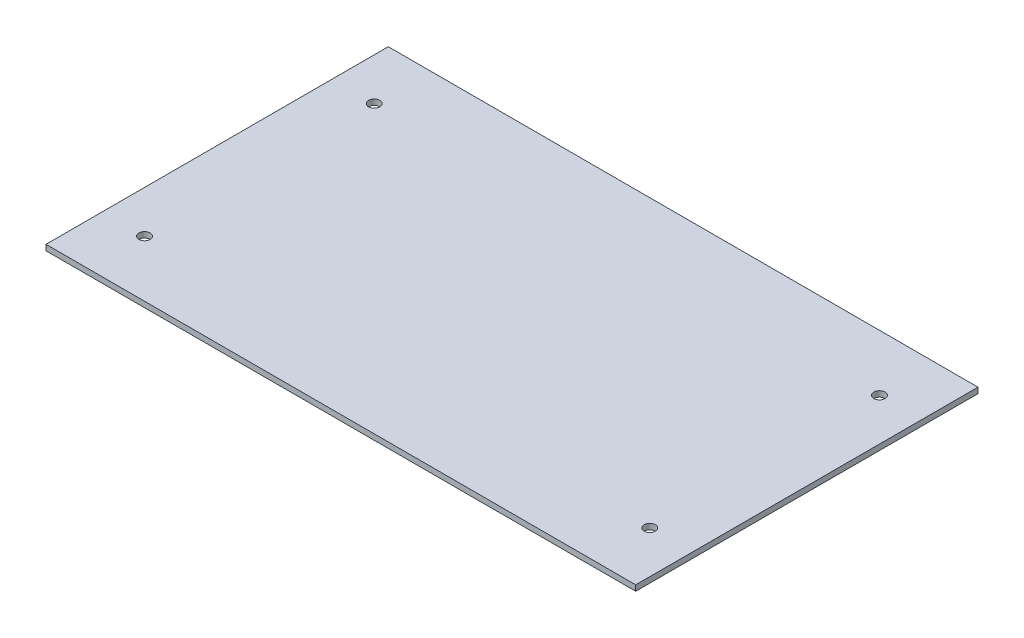
ISO-10303-21;
HEADER;
FILE_DESCRIPTION(('STEP AP214'),'2;1');
FILE_NAME('part.step','',(''),(''),'','','');
FILE_SCHEMA(('AUTOMOTIVE_DESIGN { 1 0 10303 214 1 1 1 1 }'));
ENDSEC;
DATA;
#1=APPLICATION_CONTEXT('core data for automotive mechanical design processes');
#2=APPLICATION_PROTOCOL_DEFINITION('international standard','automotive_design',2000,#1);
#3=PRODUCT_CONTEXT('',#1,'mechanical');
#4=PRODUCT('Part','Part','',(#3));
#5=PRODUCT_RELATED_PRODUCT_CATEGORY('part','',(#4));
#6=PRODUCT_DEFINITION_FORMATION('','',#4);
#7=PRODUCT_DEFINITION_CONTEXT('part definition',#1,'design');
#8=PRODUCT_DEFINITION('design','',#6,#7);
#9=PRODUCT_DEFINITION_SHAPE('','',#8);
#10=(LENGTH_UNIT() NAMED_UNIT(*) SI_UNIT(.MILLI.,.METRE.));
#11=(NAMED_UNIT(*) PLANE_ANGLE_UNIT() SI_UNIT($,.RADIAN.));
#12=(NAMED_UNIT(*) SI_UNIT($,.STERADIAN.) SOLID_ANGLE_UNIT());
#13=UNCERTAINTY_MEASURE_WITH_UNIT(LENGTH_MEASURE(1.E-05),#10,'distance_accuracy_value','');
#14=(GEOMETRIC_REPRESENTATION_CONTEXT(3) GLOBAL_UNCERTAINTY_ASSIGNED_CONTEXT((#13)) GLOBAL_UNIT_ASSIGNED_CONTEXT((#10,
#11,#12)) REPRESENTATION_CONTEXT('',''));
#15=CARTESIAN_POINT('',(0.,0.,0.));
#16=DIRECTION('',(0.,0.,1.));
#17=DIRECTION('',(1.,0.,0.));
#18=AXIS2_PLACEMENT_3D('',#15,#16,#17);
#19=CARTESIAN_POINT('',(-77.5876866384084,2.,-32.8522167487685));
#20=DIRECTION('',(1.,0.,0.));
#21=DIRECTION('',(0.,0.,-1.));
#22=AXIS2_PLACEMENT_3D('',#19,#20,#21);
#23=PLANE('',#22);
#24=DIRECTION('',(0.,0.,1.));
#25=VECTOR('',#24,1.);
#26=CARTESIAN_POINT('',(-77.5876866384084,0.,-32.8522167487685));
#27=LINE('',#26,#25);
#28=CARTESIAN_POINT('',(-77.5876866384084,0.,-32.8522167487685));
#29=VERTEX_POINT('',#28);
#30=CARTESIAN_POINT('',(-77.5876866384084,0.,88.7477832512315));
#31=VERTEX_POINT('',#30);
#32=EDGE_CURVE('E95',#29,#31,#27,.T.);
#33=ORIENTED_EDGE('',*,*,#32,.T.);
#34=DIRECTION('',(0.,-1.,0.));
#35=VECTOR('',#34,1.);
#36=CARTESIAN_POINT('',(-77.5876866384084,2.,88.7477832512315));
#37=LINE('',#36,#35);
#38=CARTESIAN_POINT('',(-77.5876866384084,2.,88.7477832512315));
#39=VERTEX_POINT('',#38);
#40=EDGE_CURVE('E11',#39,#31,#37,.T.);
#41=ORIENTED_EDGE('',*,*,#40,.F.);
#42=DIRECTION('',(0.,0.,1.));
#43=VECTOR('',#42,1.);
#44=CARTESIAN_POINT('',(-77.5876866384084,2.,-32.8522167487685));
#45=LINE('',#44,#43);
#46=CARTESIAN_POINT('',(-77.5876866384084,2.,-32.8522167487685));
#47=VERTEX_POINT('',#46);
#48=EDGE_CURVE('E83',#47,#39,#45,.T.);
#49=ORIENTED_EDGE('',*,*,#48,.F.);
#50=DIRECTION('',(0.,-1.,0.));
#51=VECTOR('',#50,1.);
#52=CARTESIAN_POINT('',(-77.5876866384084,2.,-32.8522167487685));
#53=LINE('',#52,#51);
#54=EDGE_CURVE('E91',#47,#29,#53,.T.);
#55=ORIENTED_EDGE('',*,*,#54,.T.);
#56=EDGE_LOOP('',(#33,#41,#49,#55));
#57=FACE_BOUND('',#56,.T.);
#58=ADVANCED_FACE('F32',(#57),#23,.F.);
#59=CARTESIAN_POINT('',(-77.5876866384084,2.,88.7477832512315));
#60=DIRECTION('',(0.,0.,-1.));
#61=DIRECTION('',(-1.,0.,0.));
#62=AXIS2_PLACEMENT_3D('',#59,#60,#61);
#63=PLANE('',#62);
#64=DIRECTION('',(1.,0.,0.));
#65=VECTOR('',#64,1.);
#66=CARTESIAN_POINT('',(-77.5876866384084,0.,88.7477832512315));
#67=LINE('',#66,#65);
#68=CARTESIAN_POINT('',(131.912313361592,0.,88.7477832512315));
#69=VERTEX_POINT('',#68);
#70=EDGE_CURVE('E87',#31,#69,#67,.T.);
#71=ORIENTED_EDGE('',*,*,#70,.T.);
#72=DIRECTION('',(0.,-1.,0.));
#73=VECTOR('',#72,1.);
#74=CARTESIAN_POINT('',(131.912313361592,2.,88.7477832512315));
#75=LINE('',#74,#73);
#76=CARTESIAN_POINT('',(131.912313361592,2.,88.7477832512315));
#77=VERTEX_POINT('',#76);
#78=EDGE_CURVE('E40',#77,#69,#75,.T.);
#79=ORIENTED_EDGE('',*,*,#78,.F.);
#80=DIRECTION('',(1.,0.,0.));
#81=VECTOR('',#80,1.);
#82=CARTESIAN_POINT('',(-77.5876866384084,2.,88.7477832512315));
#83=LINE('',#82,#81);
#84=EDGE_CURVE('E78',#39,#77,#83,.T.);
#85=ORIENTED_EDGE('',*,*,#84,.F.);
#86=ORIENTED_EDGE('',*,*,#40,.T.);
#87=EDGE_LOOP('',(#71,#79,#85,#86));
#88=FACE_BOUND('',#87,.T.);
#89=ADVANCED_FACE('F86',(#88),#63,.F.);
#90=CARTESIAN_POINT('',(131.912313361592,2.,-32.8522167487685));
#91=DIRECTION('',(-1.,0.,0.));
#92=DIRECTION('',(0.,0.,1.));
#93=AXIS2_PLACEMENT_3D('',#90,#91,#92);
#94=PLANE('',#93);
#95=DIRECTION('',(0.,0.,-1.));
#96=VECTOR('',#95,1.);
#97=CARTESIAN_POINT('',(131.912313361592,0.,-32.8522167487685));
#98=LINE('',#97,#96);
#99=CARTESIAN_POINT('',(131.912313361592,0.,-32.8522167487685));
#100=VERTEX_POINT('',#99);
#101=EDGE_CURVE('E65',#69,#100,#98,.T.);
#102=ORIENTED_EDGE('',*,*,#101,.T.);
#103=DIRECTION('',(0.,-1.,0.));
#104=VECTOR('',#103,1.);
#105=CARTESIAN_POINT('',(131.912313361592,2.,-32.8522167487685));
#106=LINE('',#105,#104);
#107=CARTESIAN_POINT('',(131.912313361592,2.,-32.8522167487685));
#108=VERTEX_POINT('',#107);
#109=EDGE_CURVE('E88',#108,#100,#106,.T.);
#110=ORIENTED_EDGE('',*,*,#109,.F.);
#111=DIRECTION('',(0.,0.,-1.));
#112=VECTOR('',#111,1.);
#113=CARTESIAN_POINT('',(131.912313361592,2.,-32.8522167487685));
#114=LINE('',#113,#112);
#115=EDGE_CURVE('E81',#77,#108,#114,.T.);
#116=ORIENTED_EDGE('',*,*,#115,.F.);
#117=ORIENTED_EDGE('',*,*,#78,.T.);
#118=EDGE_LOOP('',(#102,#110,#116,#117));
#119=FACE_BOUND('',#118,.T.);
#120=ADVANCED_FACE('F89',(#119),#94,.F.);
#121=CARTESIAN_POINT('',(-77.5876866384084,2.,-32.8522167487685));
#122=DIRECTION('',(0.,0.,1.));
#123=DIRECTION('',(1.,0.,0.));
#124=AXIS2_PLACEMENT_3D('',#121,#122,#123);
#125=PLANE('',#124);
#126=DIRECTION('',(-1.,0.,0.));
#127=VECTOR('',#126,1.);
#128=CARTESIAN_POINT('',(-77.5876866384084,0.,-32.8522167487685));
#129=LINE('',#128,#127);
#130=EDGE_CURVE('E71',#100,#29,#129,.T.);
#131=ORIENTED_EDGE('',*,*,#130,.T.);
#132=ORIENTED_EDGE('',*,*,#54,.F.);
#133=DIRECTION('',(-1.,0.,0.));
#134=VECTOR('',#133,1.);
#135=CARTESIAN_POINT('',(-77.5876866384084,2.,-32.8522167487685));
#136=LINE('',#135,#134);
#137=EDGE_CURVE('E48',#108,#47,#136,.T.);
#138=ORIENTED_EDGE('',*,*,#137,.F.);
#139=ORIENTED_EDGE('',*,*,#109,.T.);
#140=EDGE_LOOP('',(#131,#132,#138,#139));
#141=FACE_BOUND('',#140,.T.);
#142=ADVANCED_FACE('F103',(#141),#125,.F.);
#143=CARTESIAN_POINT('',(0.,2.,0.));
#144=DIRECTION('',(0.,1.,0.));
#145=DIRECTION('',(0.,0.,1.));
#146=AXIS2_PLACEMENT_3D('',#143,#144,#145);
#147=PLANE('',#146);
#148=CARTESIAN_POINT('',(116.912313361592,2.,-12.8522167487685));
#149=DIRECTION('',(0.,1.,0.));
#150=DIRECTION('',(0.,0.,1.));
#151=AXIS2_PLACEMENT_3D('',#148,#149,#150);
#152=CIRCLE('',#151,2.);
#153=CARTESIAN_POINT('',(116.912313361592,2.,-10.8522167487685));
#154=VERTEX_POINT('',#153);
#155=EDGE_CURVE('E98',#154,#154,#152,.T.);
#156=ORIENTED_EDGE('',*,*,#155,.F.);
#157=EDGE_LOOP('',(#156));
#158=FACE_BOUND('',#157,.T.);
#159=CARTESIAN_POINT('',(-62.5876866384083,2.,68.7477832512315));
#160=DIRECTION('',(0.,1.,0.));
#161=DIRECTION('',(0.,0.,1.));
#162=AXIS2_PLACEMENT_3D('',#159,#160,#161);
#163=CIRCLE('',#162,2.);
#164=CARTESIAN_POINT('',(-62.5876866384083,2.,70.7477832512315));
#165=VERTEX_POINT('',#164);
#166=EDGE_CURVE('E111',#165,#165,#163,.T.);
#167=ORIENTED_EDGE('',*,*,#166,.F.);
#168=EDGE_LOOP('',(#167));
#169=FACE_BOUND('',#168,.T.);
#170=CARTESIAN_POINT('',(116.912313361592,2.,68.7477832512315));
#171=DIRECTION('',(0.,1.,0.));
#172=DIRECTION('',(0.,0.,1.));
#173=AXIS2_PLACEMENT_3D('',#170,#171,#172);
#174=CIRCLE('',#173,2.);
#175=CARTESIAN_POINT('',(116.912313361592,2.,70.7477832512315));
#176=VERTEX_POINT('',#175);
#177=EDGE_CURVE('E114',#176,#176,#174,.T.);
#178=ORIENTED_EDGE('',*,*,#177,.F.);
#179=EDGE_LOOP('',(#178));
#180=FACE_BOUND('',#179,.T.);
#181=CARTESIAN_POINT('',(-62.5876866384083,2.,-12.8522167487685));
#182=DIRECTION('',(0.,1.,0.));
#183=DIRECTION('',(0.,0.,1.));
#184=AXIS2_PLACEMENT_3D('',#181,#182,#183);
#185=CIRCLE('',#184,2.);
#186=CARTESIAN_POINT('',(-62.5876866384083,2.,-10.8522167487685));
#187=VERTEX_POINT('',#186);
#188=EDGE_CURVE('E117',#187,#187,#185,.T.);
#189=ORIENTED_EDGE('',*,*,#188,.F.);
#190=EDGE_LOOP('',(#189));
#191=FACE_BOUND('',#190,.T.);
#192=ORIENTED_EDGE('',*,*,#48,.T.);
#193=ORIENTED_EDGE('',*,*,#84,.T.);
#194=ORIENTED_EDGE('',*,*,#115,.T.);
#195=ORIENTED_EDGE('',*,*,#137,.T.);
#196=EDGE_LOOP('',(#192,#193,#194,#195));
#197=FACE_BOUND('',#196,.T.);
#198=ADVANCED_FACE('F79',(#158,#169,#180,#191,#197),#147,.T.);
#199=CARTESIAN_POINT('',(0.,0.,0.));
#200=DIRECTION('',(0.,1.,0.));
#201=DIRECTION('',(0.,0.,1.));
#202=AXIS2_PLACEMENT_3D('',#199,#200,#201);
#203=PLANE('',#202);
#204=CARTESIAN_POINT('',(116.912313361592,0.,-12.8522167487685));
#205=DIRECTION('',(0.,1.,0.));
#206=DIRECTION('',(0.,0.,1.));
#207=AXIS2_PLACEMENT_3D('',#204,#205,#206);
#208=CIRCLE('',#207,2.);
#209=CARTESIAN_POINT('',(116.912313361592,0.,-10.8522167487685));
#210=VERTEX_POINT('',#209);
#211=EDGE_CURVE('E123',#210,#210,#208,.T.);
#212=ORIENTED_EDGE('',*,*,#211,.T.);
#213=EDGE_LOOP('',(#212));
#214=FACE_BOUND('',#213,.T.);
#215=CARTESIAN_POINT('',(-62.5876866384083,0.,68.7477832512315));
#216=DIRECTION('',(0.,1.,0.));
#217=DIRECTION('',(0.,0.,1.));
#218=AXIS2_PLACEMENT_3D('',#215,#216,#217);
#219=CIRCLE('',#218,2.);
#220=CARTESIAN_POINT('',(-62.5876866384083,0.,70.7477832512315));
#221=VERTEX_POINT('',#220);
#222=EDGE_CURVE('E124',#221,#221,#219,.T.);
#223=ORIENTED_EDGE('',*,*,#222,.T.);
#224=EDGE_LOOP('',(#223));
#225=FACE_BOUND('',#224,.T.);
#226=CARTESIAN_POINT('',(116.912313361592,0.,68.7477832512315));
#227=DIRECTION('',(0.,1.,0.));
#228=DIRECTION('',(0.,0.,1.));
#229=AXIS2_PLACEMENT_3D('',#226,#227,#228);
#230=CIRCLE('',#229,2.);
#231=CARTESIAN_POINT('',(116.912313361592,0.,70.7477832512315));
#232=VERTEX_POINT('',#231);
#233=EDGE_CURVE('E127',#232,#232,#230,.T.);
#234=ORIENTED_EDGE('',*,*,#233,.T.);
#235=EDGE_LOOP('',(#234));
#236=FACE_BOUND('',#235,.T.);
#237=CARTESIAN_POINT('',(-62.5876866384083,0.,-12.8522167487685));
#238=DIRECTION('',(0.,1.,0.));
#239=DIRECTION('',(0.,0.,1.));
#240=AXIS2_PLACEMENT_3D('',#237,#238,#239);
#241=CIRCLE('',#240,2.);
#242=CARTESIAN_POINT('',(-62.5876866384083,0.,-10.8522167487685));
#243=VERTEX_POINT('',#242);
#244=EDGE_CURVE('E120',#243,#243,#241,.T.);
#245=ORIENTED_EDGE('',*,*,#244,.T.);
#246=EDGE_LOOP('',(#245));
#247=FACE_BOUND('',#246,.T.);
#248=ORIENTED_EDGE('',*,*,#32,.F.);
#249=ORIENTED_EDGE('',*,*,#130,.F.);
#250=ORIENTED_EDGE('',*,*,#101,.F.);
#251=ORIENTED_EDGE('',*,*,#70,.F.);
#252=EDGE_LOOP('',(#248,#249,#250,#251));
#253=FACE_BOUND('',#252,.T.);
#254=ADVANCED_FACE('F106',(#214,#225,#236,#247,#253),#203,.F.);
#255=CARTESIAN_POINT('',(-62.5876866384083,0.,-12.8522167487685));
#256=DIRECTION('',(0.,1.,0.));
#257=DIRECTION('',(0.,0.,1.));
#258=AXIS2_PLACEMENT_3D('',#255,#256,#257);
#259=CYLINDRICAL_SURFACE('',#258,2.);
#260=ORIENTED_EDGE('',*,*,#188,.T.);
#261=EDGE_LOOP('',(#260));
#262=FACE_BOUND('',#261,.T.);
#263=ORIENTED_EDGE('',*,*,#244,.F.);
#264=EDGE_LOOP('',(#263));
#265=FACE_BOUND('',#264,.T.);
#266=ADVANCED_FACE('F138',(#262,#265),#259,.F.);
#267=CARTESIAN_POINT('',(116.912313361592,0.,68.7477832512315));
#268=DIRECTION('',(0.,1.,0.));
#269=DIRECTION('',(0.,0.,1.));
#270=AXIS2_PLACEMENT_3D('',#267,#268,#269);
#271=CYLINDRICAL_SURFACE('',#270,2.);
#272=ORIENTED_EDGE('',*,*,#177,.T.);
#273=EDGE_LOOP('',(#272));
#274=FACE_BOUND('',#273,.T.);
#275=ORIENTED_EDGE('',*,*,#233,.F.);
#276=EDGE_LOOP('',(#275));
#277=FACE_BOUND('',#276,.T.);
#278=ADVANCED_FACE('F135',(#274,#277),#271,.F.);
#279=CARTESIAN_POINT('',(-62.5876866384083,0.,68.7477832512315));
#280=DIRECTION('',(0.,1.,0.));
#281=DIRECTION('',(0.,0.,1.));
#282=AXIS2_PLACEMENT_3D('',#279,#280,#281);
#283=CYLINDRICAL_SURFACE('',#282,2.);
#284=ORIENTED_EDGE('',*,*,#166,.T.);
#285=EDGE_LOOP('',(#284));
#286=FACE_BOUND('',#285,.T.);
#287=ORIENTED_EDGE('',*,*,#222,.F.);
#288=EDGE_LOOP('',(#287));
#289=FACE_BOUND('',#288,.T.);
#290=ADVANCED_FACE('F137',(#286,#289),#283,.F.);
#291=CARTESIAN_POINT('',(116.912313361592,0.,-12.8522167487685));
#292=DIRECTION('',(0.,1.,0.));
#293=DIRECTION('',(0.,0.,1.));
#294=AXIS2_PLACEMENT_3D('',#291,#292,#293);
#295=CYLINDRICAL_SURFACE('',#294,2.);
#296=ORIENTED_EDGE('',*,*,#155,.T.);
#297=EDGE_LOOP('',(#296));
#298=FACE_BOUND('',#297,.T.);
#299=ORIENTED_EDGE('',*,*,#211,.F.);
#300=EDGE_LOOP('',(#299));
#301=FACE_BOUND('',#300,.T.);
#302=ADVANCED_FACE('F145',(#298,#301),#295,.F.);
#303=CLOSED_SHELL('',(#58,#89,#120,#142,#198,#254,#266,#278,#290,#302));
#304=MANIFOLD_SOLID_BREP('B2',#303);
#305=ADVANCED_BREP_SHAPE_REPRESENTATION('',(#18,#304),#14);
#306=SHAPE_DEFINITION_REPRESENTATION(#9,#305);
ENDSEC;
END-ISO-10303-21;
